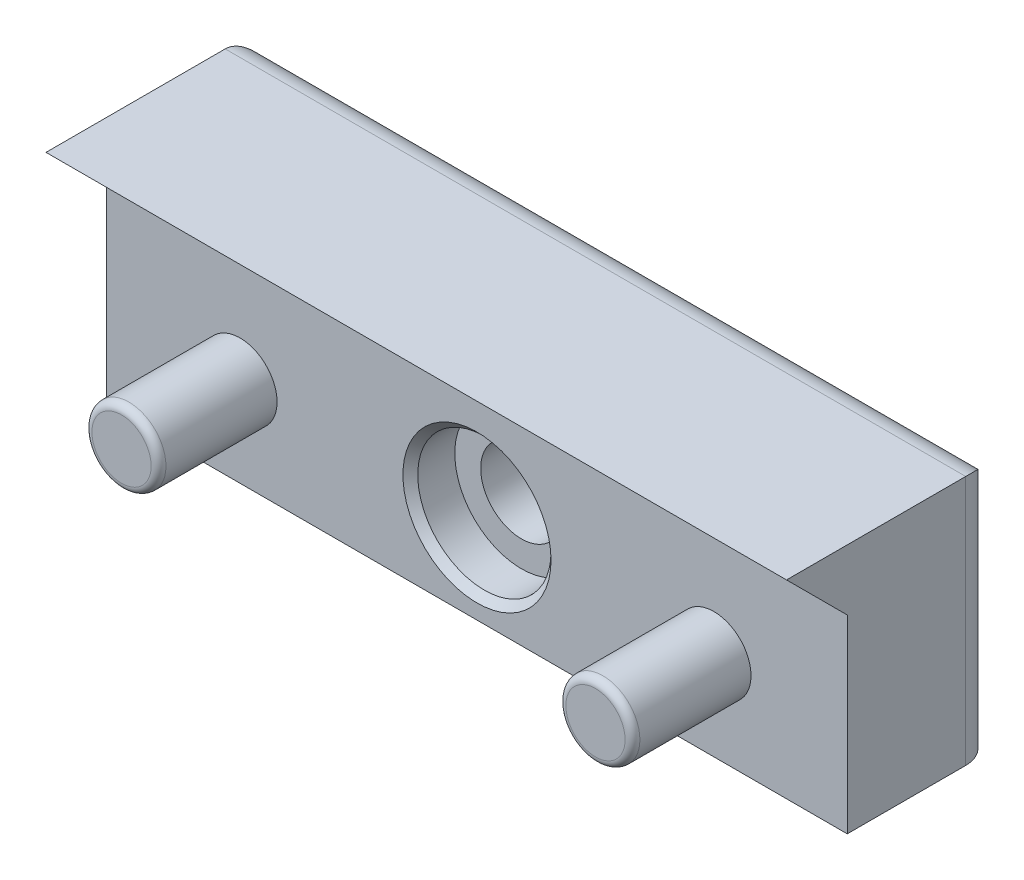
ISO-10303-21;
HEADER;
FILE_DESCRIPTION(('STEP AP214'),'2;1');
FILE_NAME('part.step','',(''),(''),'','','');
FILE_SCHEMA(('AUTOMOTIVE_DESIGN { 1 0 10303 214 1 1 1 1 }'));
ENDSEC;
DATA;
#1=APPLICATION_CONTEXT('core data for automotive mechanical design processes');
#2=APPLICATION_PROTOCOL_DEFINITION('international standard','automotive_design',2000,#1);
#3=PRODUCT_CONTEXT('',#1,'mechanical');
#4=PRODUCT('Part','Part','',(#3));
#5=PRODUCT_RELATED_PRODUCT_CATEGORY('part','',(#4));
#6=PRODUCT_DEFINITION_FORMATION('','',#4);
#7=PRODUCT_DEFINITION_CONTEXT('part definition',#1,'design');
#8=PRODUCT_DEFINITION('design','',#6,#7);
#9=PRODUCT_DEFINITION_SHAPE('','',#8);
#10=(LENGTH_UNIT() NAMED_UNIT(*) SI_UNIT(.MILLI.,.METRE.));
#11=(NAMED_UNIT(*) PLANE_ANGLE_UNIT() SI_UNIT($,.RADIAN.));
#12=(NAMED_UNIT(*) SI_UNIT($,.STERADIAN.) SOLID_ANGLE_UNIT());
#13=UNCERTAINTY_MEASURE_WITH_UNIT(LENGTH_MEASURE(1.E-05),#10,'distance_accuracy_value','');
#14=(GEOMETRIC_REPRESENTATION_CONTEXT(3) GLOBAL_UNCERTAINTY_ASSIGNED_CONTEXT((#13)) GLOBAL_UNIT_ASSIGNED_CONTEXT((#10,
#11,#12)) REPRESENTATION_CONTEXT('',''));
#15=CARTESIAN_POINT('',(0.,0.,0.));
#16=DIRECTION('',(0.,0.,1.));
#17=DIRECTION('',(1.,0.,0.));
#18=AXIS2_PLACEMENT_3D('',#15,#16,#17);
#19=CARTESIAN_POINT('',(0.,0.,0.));
#20=DIRECTION('',(0.,0.,1.));
#21=DIRECTION('',(1.,0.,0.));
#22=AXIS2_PLACEMENT_3D('',#19,#20,#21);
#23=CYLINDRICAL_SURFACE('',#22,2.75);
#24=CARTESIAN_POINT('',(0.,0.,0.));
#25=DIRECTION('',(0.,0.,1.));
#26=DIRECTION('',(1.,0.,0.));
#27=AXIS2_PLACEMENT_3D('',#24,#25,#26);
#28=CIRCLE('',#27,2.75);
#29=CARTESIAN_POINT('',(2.75,0.,0.));
#30=VERTEX_POINT('',#29);
#31=EDGE_CURVE('E140',#30,#30,#28,.T.);
#32=ORIENTED_EDGE('',*,*,#31,.F.);
#33=EDGE_LOOP('',(#32));
#34=FACE_BOUND('',#33,.T.);
#35=CARTESIAN_POINT('',(0.,0.,7.));
#36=DIRECTION('',(0.,0.,1.));
#37=DIRECTION('',(1.,0.,0.));
#38=AXIS2_PLACEMENT_3D('',#35,#36,#37);
#39=CIRCLE('',#38,2.75);
#40=CARTESIAN_POINT('',(2.75,0.,7.));
#41=VERTEX_POINT('',#40);
#42=EDGE_CURVE('E174',#41,#41,#39,.F.);
#43=ORIENTED_EDGE('',*,*,#42,.F.);
#44=EDGE_LOOP('',(#43));
#45=FACE_BOUND('',#44,.T.);
#46=ADVANCED_FACE('F33',(#34,#45),#23,.F.);
#47=CARTESIAN_POINT('',(-25.,-8.00000000000001,10.));
#48=DIRECTION('',(1.,0.,0.));
#49=DIRECTION('',(0.,0.,-1.));
#50=AXIS2_PLACEMENT_3D('',#47,#48,#49);
#51=PLANE('',#50);
#52=DIRECTION('',(0.,0.,1.));
#53=VECTOR('',#52,1.);
#54=CARTESIAN_POINT('',(-25.,10.9,10.));
#55=LINE('',#54,#53);
#56=CARTESIAN_POINT('',(-25.,10.9,2.));
#57=VERTEX_POINT('',#56);
#58=CARTESIAN_POINT('',(-25.,10.9,14.1));
#59=VERTEX_POINT('',#58);
#60=EDGE_CURVE('E95',#57,#59,#55,.T.);
#61=ORIENTED_EDGE('',*,*,#60,.F.);
#62=DIRECTION('',(0.,-1.,0.));
#63=VECTOR('',#62,1.);
#64=CARTESIAN_POINT('',(-25.,-8.00000000000001,2.));
#65=LINE('',#64,#63);
#66=CARTESIAN_POINT('',(-25.,-6.00000000000001,2.));
#67=VERTEX_POINT('',#66);
#68=EDGE_CURVE('E56',#57,#67,#65,.T.);
#69=ORIENTED_EDGE('',*,*,#68,.T.);
#70=DIRECTION('',(0.,0.,-1.));
#71=VECTOR('',#70,1.);
#72=CARTESIAN_POINT('',(-25.,-6.00000000000001,10.));
#73=LINE('',#72,#71);
#74=CARTESIAN_POINT('',(-25.,-6.00000000000001,10.));
#75=VERTEX_POINT('',#74);
#76=EDGE_CURVE('E130',#75,#67,#73,.T.);
#77=ORIENTED_EDGE('',*,*,#76,.F.);
#78=DIRECTION('',(0.,-1.,0.));
#79=VECTOR('',#78,1.);
#80=CARTESIAN_POINT('',(-25.,-8.00000000000001,10.));
#81=LINE('',#80,#79);
#82=CARTESIAN_POINT('',(-25.,6.8,10.));
#83=VERTEX_POINT('',#82);
#84=EDGE_CURVE('E117',#83,#75,#81,.T.);
#85=ORIENTED_EDGE('',*,*,#84,.F.);
#86=DIRECTION('',(0.,-0.707106781186548,-0.707106781186548));
#87=VECTOR('',#86,1.);
#88=CARTESIAN_POINT('',(-25.,10.9,14.1));
#89=LINE('',#88,#87);
#90=EDGE_CURVE('E109',#59,#83,#89,.T.);
#91=ORIENTED_EDGE('',*,*,#90,.F.);
#92=EDGE_LOOP('',(#61,#69,#77,#85,#91));
#93=FACE_BOUND('',#92,.T.);
#94=ADVANCED_FACE('F116',(#93),#51,.F.);
#95=CARTESIAN_POINT('',(25.,-8.,10.));
#96=DIRECTION('',(-1.,0.,0.));
#97=DIRECTION('',(0.,0.,1.));
#98=AXIS2_PLACEMENT_3D('',#95,#96,#97);
#99=PLANE('',#98);
#100=DIRECTION('',(0.,0.,1.));
#101=VECTOR('',#100,1.);
#102=CARTESIAN_POINT('',(25.,-6.,10.));
#103=LINE('',#102,#101);
#104=CARTESIAN_POINT('',(25.,-6.,2.));
#105=VERTEX_POINT('',#104);
#106=CARTESIAN_POINT('',(25.,-6.,10.));
#107=VERTEX_POINT('',#106);
#108=EDGE_CURVE('E104',#105,#107,#103,.T.);
#109=ORIENTED_EDGE('',*,*,#108,.F.);
#110=DIRECTION('',(0.,1.,0.));
#111=VECTOR('',#110,1.);
#112=CARTESIAN_POINT('',(25.,-8.,2.));
#113=LINE('',#112,#111);
#114=CARTESIAN_POINT('',(25.,10.9,2.));
#115=VERTEX_POINT('',#114);
#116=EDGE_CURVE('E170',#105,#115,#113,.T.);
#117=ORIENTED_EDGE('',*,*,#116,.T.);
#118=DIRECTION('',(0.,0.,-1.));
#119=VECTOR('',#118,1.);
#120=CARTESIAN_POINT('',(25.,10.9,10.));
#121=LINE('',#120,#119);
#122=CARTESIAN_POINT('',(25.,10.9,14.1));
#123=VERTEX_POINT('',#122);
#124=EDGE_CURVE('E105',#123,#115,#121,.T.);
#125=ORIENTED_EDGE('',*,*,#124,.F.);
#126=DIRECTION('',(0.,-0.707106781186548,-0.707106781186548));
#127=VECTOR('',#126,1.);
#128=CARTESIAN_POINT('',(25.,10.9,14.1));
#129=LINE('',#128,#127);
#130=CARTESIAN_POINT('',(25.,6.8,10.));
#131=VERTEX_POINT('',#130);
#132=EDGE_CURVE('E112',#123,#131,#129,.T.);
#133=ORIENTED_EDGE('',*,*,#132,.T.);
#134=DIRECTION('',(0.,1.,0.));
#135=VECTOR('',#134,1.);
#136=CARTESIAN_POINT('',(25.,-8.,10.));
#137=LINE('',#136,#135);
#138=EDGE_CURVE('E144',#107,#131,#137,.T.);
#139=ORIENTED_EDGE('',*,*,#138,.F.);
#140=EDGE_LOOP('',(#109,#117,#125,#133,#139));
#141=FACE_BOUND('',#140,.T.);
#142=ADVANCED_FACE('F200',(#141),#99,.F.);
#143=CARTESIAN_POINT('',(0.,0.,10.));
#144=DIRECTION('',(0.,0.,1.));
#145=DIRECTION('',(1.,0.,0.));
#146=AXIS2_PLACEMENT_3D('',#143,#144,#145);
#147=PLANE('',#146);
#148=CARTESIAN_POINT('',(0.,0.,10.));
#149=DIRECTION('',(0.,0.,1.));
#150=DIRECTION('',(1.,0.,0.));
#151=AXIS2_PLACEMENT_3D('',#148,#149,#150);
#152=CIRCLE('',#151,5.00000000000002);
#153=CARTESIAN_POINT('',(5.00000000000002,0.,10.));
#154=VERTEX_POINT('',#153);
#155=EDGE_CURVE('E11',#154,#154,#152,.F.);
#156=ORIENTED_EDGE('',*,*,#155,.T.);
#157=EDGE_LOOP('',(#156));
#158=FACE_BOUND('',#157,.T.);
#159=DIRECTION('',(1.,0.,0.));
#160=VECTOR('',#159,1.);
#161=CARTESIAN_POINT('',(-25.,6.8,10.));
#162=LINE('',#161,#160);
#163=EDGE_CURVE('E113',#83,#131,#162,.T.);
#164=ORIENTED_EDGE('',*,*,#163,.F.);
#165=ORIENTED_EDGE('',*,*,#84,.T.);
#166=DIRECTION('',(-1.,0.,0.));
#167=VECTOR('',#166,1.);
#168=CARTESIAN_POINT('',(25.,-6.,10.));
#169=LINE('',#168,#167);
#170=EDGE_CURVE('E127',#107,#75,#169,.T.);
#171=ORIENTED_EDGE('',*,*,#170,.F.);
#172=ORIENTED_EDGE('',*,*,#138,.T.);
#173=EDGE_LOOP('',(#164,#165,#171,#172));
#174=FACE_BOUND('',#173,.T.);
#175=CARTESIAN_POINT('',(16.,0.,10.));
#176=DIRECTION('',(0.,0.,1.));
#177=DIRECTION('',(1.,0.,0.));
#178=AXIS2_PLACEMENT_3D('',#175,#176,#177);
#179=CIRCLE('',#178,2.5);
#180=CARTESIAN_POINT('',(18.5,0.,10.));
#181=VERTEX_POINT('',#180);
#182=EDGE_CURVE('E134',#181,#181,#179,.T.);
#183=ORIENTED_EDGE('',*,*,#182,.F.);
#184=EDGE_LOOP('',(#183));
#185=FACE_BOUND('',#184,.T.);
#186=CARTESIAN_POINT('',(-16.,0.,10.));
#187=DIRECTION('',(0.,0.,1.));
#188=DIRECTION('',(1.,0.,0.));
#189=AXIS2_PLACEMENT_3D('',#186,#187,#188);
#190=CIRCLE('',#189,2.5);
#191=CARTESIAN_POINT('',(-13.5,0.,10.));
#192=VERTEX_POINT('',#191);
#193=EDGE_CURVE('E137',#192,#192,#190,.T.);
#194=ORIENTED_EDGE('',*,*,#193,.F.);
#195=EDGE_LOOP('',(#194));
#196=FACE_BOUND('',#195,.T.);
#197=ADVANCED_FACE('F208',(#158,#174,#185,#196),#147,.T.);
#198=CARTESIAN_POINT('',(0.,0.,0.));
#199=DIRECTION('',(0.,0.,1.));
#200=DIRECTION('',(1.,0.,0.));
#201=AXIS2_PLACEMENT_3D('',#198,#199,#200);
#202=PLANE('',#201);
#203=ORIENTED_EDGE('',*,*,#31,.T.);
#204=EDGE_LOOP('',(#203));
#205=FACE_BOUND('',#204,.T.);
#206=DIRECTION('',(1.,0.,0.));
#207=VECTOR('',#206,1.);
#208=CARTESIAN_POINT('',(25.,-6.,0.));
#209=LINE('',#208,#207);
#210=CARTESIAN_POINT('',(-23.,-6.00000000000001,0.));
#211=VERTEX_POINT('',#210);
#212=CARTESIAN_POINT('',(23.,-6.,0.));
#213=VERTEX_POINT('',#212);
#214=EDGE_CURVE('E132',#211,#213,#209,.T.);
#215=ORIENTED_EDGE('',*,*,#214,.F.);
#216=DIRECTION('',(0.,-1.,0.));
#217=VECTOR('',#216,1.);
#218=CARTESIAN_POINT('',(-23.,0.,0.));
#219=LINE('',#218,#217);
#220=CARTESIAN_POINT('',(-23.,8.9,0.));
#221=VERTEX_POINT('',#220);
#222=EDGE_CURVE('E164',#211,#221,#219,.F.);
#223=ORIENTED_EDGE('',*,*,#222,.T.);
#224=DIRECTION('',(-1.,0.,0.));
#225=VECTOR('',#224,1.);
#226=CARTESIAN_POINT('',(25.,8.9,0.));
#227=LINE('',#226,#225);
#228=CARTESIAN_POINT('',(23.,8.9,0.));
#229=VERTEX_POINT('',#228);
#230=EDGE_CURVE('E162',#221,#229,#227,.F.);
#231=ORIENTED_EDGE('',*,*,#230,.T.);
#232=DIRECTION('',(0.,1.,0.));
#233=VECTOR('',#232,1.);
#234=CARTESIAN_POINT('',(23.,0.,0.));
#235=LINE('',#234,#233);
#236=EDGE_CURVE('E160',#229,#213,#235,.F.);
#237=ORIENTED_EDGE('',*,*,#236,.T.);
#238=EDGE_LOOP('',(#215,#223,#231,#237));
#239=FACE_BOUND('',#238,.T.);
#240=ADVANCED_FACE('F211',(#205,#239),#202,.F.);
#241=CARTESIAN_POINT('',(-16.,0.,18.));
#242=DIRECTION('',(0.,0.,-1.));
#243=DIRECTION('',(-1.,0.,0.));
#244=AXIS2_PLACEMENT_3D('',#241,#242,#243);
#245=CYLINDRICAL_SURFACE('',#244,2.5);
#246=CARTESIAN_POINT('',(-16.,0.,17.5));
#247=DIRECTION('',(0.,0.,1.));
#248=DIRECTION('',(1.,0.,0.));
#249=AXIS2_PLACEMENT_3D('',#246,#247,#248);
#250=CIRCLE('',#249,2.5);
#251=CARTESIAN_POINT('',(-13.5,0.,17.5));
#252=VERTEX_POINT('',#251);
#253=EDGE_CURVE('E156',#252,#252,#250,.F.);
#254=ORIENTED_EDGE('',*,*,#253,.T.);
#255=EDGE_LOOP('',(#254));
#256=FACE_BOUND('',#255,.T.);
#257=ORIENTED_EDGE('',*,*,#193,.T.);
#258=EDGE_LOOP('',(#257));
#259=FACE_BOUND('',#258,.T.);
#260=ADVANCED_FACE('F206',(#256,#259),#245,.T.);
#261=CARTESIAN_POINT('',(-16.,0.,18.));
#262=DIRECTION('',(0.,0.,1.));
#263=DIRECTION('',(1.,0.,0.));
#264=AXIS2_PLACEMENT_3D('',#261,#262,#263);
#265=PLANE('',#264);
#266=CARTESIAN_POINT('',(-16.,0.,18.));
#267=DIRECTION('',(0.,0.,1.));
#268=DIRECTION('',(1.,0.,0.));
#269=AXIS2_PLACEMENT_3D('',#266,#267,#268);
#270=CIRCLE('',#269,2.);
#271=CARTESIAN_POINT('',(-14.,0.,18.));
#272=VERTEX_POINT('',#271);
#273=EDGE_CURVE('E153',#272,#272,#270,.T.);
#274=ORIENTED_EDGE('',*,*,#273,.T.);
#275=EDGE_LOOP('',(#274));
#276=FACE_BOUND('',#275,.T.);
#277=ADVANCED_FACE('F255',(#276),#265,.T.);
#278=CARTESIAN_POINT('',(16.,0.,18.));
#279=DIRECTION('',(0.,0.,-1.));
#280=DIRECTION('',(-1.,0.,0.));
#281=AXIS2_PLACEMENT_3D('',#278,#279,#280);
#282=CYLINDRICAL_SURFACE('',#281,2.5);
#283=CARTESIAN_POINT('',(16.,0.,17.5));
#284=DIRECTION('',(0.,0.,1.));
#285=DIRECTION('',(1.,0.,0.));
#286=AXIS2_PLACEMENT_3D('',#283,#284,#285);
#287=CIRCLE('',#286,2.5);
#288=CARTESIAN_POINT('',(18.5,0.,17.5));
#289=VERTEX_POINT('',#288);
#290=EDGE_CURVE('E150',#289,#289,#287,.F.);
#291=ORIENTED_EDGE('',*,*,#290,.T.);
#292=EDGE_LOOP('',(#291));
#293=FACE_BOUND('',#292,.T.);
#294=ORIENTED_EDGE('',*,*,#182,.T.);
#295=EDGE_LOOP('',(#294));
#296=FACE_BOUND('',#295,.T.);
#297=ADVANCED_FACE('F260',(#293,#296),#282,.T.);
#298=CARTESIAN_POINT('',(16.,0.,18.));
#299=DIRECTION('',(0.,0.,1.));
#300=DIRECTION('',(1.,0.,0.));
#301=AXIS2_PLACEMENT_3D('',#298,#299,#300);
#302=PLANE('',#301);
#303=CARTESIAN_POINT('',(16.,0.,18.));
#304=DIRECTION('',(0.,0.,1.));
#305=DIRECTION('',(1.,0.,0.));
#306=AXIS2_PLACEMENT_3D('',#303,#304,#305);
#307=CIRCLE('',#306,2.);
#308=CARTESIAN_POINT('',(18.,0.,18.));
#309=VERTEX_POINT('',#308);
#310=EDGE_CURVE('E147',#309,#309,#307,.T.);
#311=ORIENTED_EDGE('',*,*,#310,.T.);
#312=EDGE_LOOP('',(#311));
#313=FACE_BOUND('',#312,.T.);
#314=ADVANCED_FACE('F223',(#313),#302,.T.);
#315=CARTESIAN_POINT('',(16.,0.,17.5));
#316=DIRECTION('',(0.,0.,1.));
#317=DIRECTION('',(1.,0.,0.));
#318=AXIS2_PLACEMENT_3D('',#315,#316,#317);
#319=TOROIDAL_SURFACE('',#318,2.,0.5);
#320=ORIENTED_EDGE('',*,*,#290,.F.);
#321=EDGE_LOOP('',(#320));
#322=FACE_BOUND('',#321,.T.);
#323=ORIENTED_EDGE('',*,*,#310,.F.);
#324=EDGE_LOOP('',(#323));
#325=FACE_BOUND('',#324,.T.);
#326=ADVANCED_FACE('F219',(#322,#325),#319,.T.);
#327=CARTESIAN_POINT('',(-16.,0.,17.5));
#328=DIRECTION('',(0.,0.,1.));
#329=DIRECTION('',(1.,0.,0.));
#330=AXIS2_PLACEMENT_3D('',#327,#328,#329);
#331=TOROIDAL_SURFACE('',#330,2.,0.5);
#332=ORIENTED_EDGE('',*,*,#253,.F.);
#333=EDGE_LOOP('',(#332));
#334=FACE_BOUND('',#333,.T.);
#335=ORIENTED_EDGE('',*,*,#273,.F.);
#336=EDGE_LOOP('',(#335));
#337=FACE_BOUND('',#336,.T.);
#338=ADVANCED_FACE('F222',(#334,#337),#331,.T.);
#339=CARTESIAN_POINT('',(0.,-6.,0.));
#340=DIRECTION('',(0.,1.,0.));
#341=DIRECTION('',(-1.,0.,0.));
#342=AXIS2_PLACEMENT_3D('',#339,#340,#341);
#343=PLANE('',#342);
#344=ORIENTED_EDGE('',*,*,#76,.T.);
#345=CARTESIAN_POINT('',(-23.,-6.00000000000001,2.));
#346=DIRECTION('',(0.,1.,0.));
#347=DIRECTION('',(-1.,0.,0.));
#348=AXIS2_PLACEMENT_3D('',#345,#346,#347);
#349=CIRCLE('',#348,2.);
#350=EDGE_CURVE('E168',#67,#211,#349,.F.);
#351=ORIENTED_EDGE('',*,*,#350,.T.);
#352=ORIENTED_EDGE('',*,*,#214,.T.);
#353=CARTESIAN_POINT('',(23.,-6.,2.));
#354=DIRECTION('',(0.,1.,0.));
#355=DIRECTION('',(-1.,0.,0.));
#356=AXIS2_PLACEMENT_3D('',#353,#354,#355);
#357=CIRCLE('',#356,2.);
#358=EDGE_CURVE('E48',#213,#105,#357,.F.);
#359=ORIENTED_EDGE('',*,*,#358,.T.);
#360=ORIENTED_EDGE('',*,*,#108,.T.);
#361=ORIENTED_EDGE('',*,*,#170,.T.);
#362=EDGE_LOOP('',(#344,#351,#352,#359,#360,#361));
#363=FACE_BOUND('',#362,.T.);
#364=ADVANCED_FACE('F227',(#363),#343,.F.);
#365=CARTESIAN_POINT('',(0.,10.9,0.));
#366=DIRECTION('',(0.,1.,0.));
#367=DIRECTION('',(-1.,0.,0.));
#368=AXIS2_PLACEMENT_3D('',#365,#366,#367);
#369=PLANE('',#368);
#370=ORIENTED_EDGE('',*,*,#124,.T.);
#371=DIRECTION('',(-1.,0.,0.));
#372=VECTOR('',#371,1.);
#373=CARTESIAN_POINT('',(-25.,10.9,2.));
#374=LINE('',#373,#372);
#375=EDGE_CURVE('E102',#115,#57,#374,.T.);
#376=ORIENTED_EDGE('',*,*,#375,.T.);
#377=ORIENTED_EDGE('',*,*,#60,.T.);
#378=DIRECTION('',(1.,0.,0.));
#379=VECTOR('',#378,1.);
#380=CARTESIAN_POINT('',(-25.,10.9,14.1));
#381=LINE('',#380,#379);
#382=EDGE_CURVE('E99',#59,#123,#381,.T.);
#383=ORIENTED_EDGE('',*,*,#382,.T.);
#384=EDGE_LOOP('',(#370,#376,#377,#383));
#385=FACE_BOUND('',#384,.T.);
#386=ADVANCED_FACE('F98',(#385),#369,.T.);
#387=CARTESIAN_POINT('',(-25.,10.9,14.1));
#388=DIRECTION('',(0.,-0.707106781186548,0.707106781186548));
#389=DIRECTION('',(0.,-0.707106781186548,-0.707106781186548));
#390=AXIS2_PLACEMENT_3D('',#387,#388,#389);
#391=PLANE('',#390);
#392=ORIENTED_EDGE('',*,*,#132,.F.);
#393=ORIENTED_EDGE('',*,*,#382,.F.);
#394=ORIENTED_EDGE('',*,*,#90,.T.);
#395=ORIENTED_EDGE('',*,*,#163,.T.);
#396=EDGE_LOOP('',(#392,#393,#394,#395));
#397=FACE_BOUND('',#396,.T.);
#398=ADVANCED_FACE('F108',(#397),#391,.T.);
#399=CARTESIAN_POINT('',(23.,-8.,2.));
#400=DIRECTION('',(0.,1.,0.));
#401=DIRECTION('',(0.,0.,1.));
#402=AXIS2_PLACEMENT_3D('',#399,#400,#401);
#403=CYLINDRICAL_SURFACE('',#402,2.);
#404=ORIENTED_EDGE('',*,*,#358,.F.);
#405=ORIENTED_EDGE('',*,*,#236,.F.);
#406=CARTESIAN_POINT('',(23.,8.9,2.));
#407=DIRECTION('',(-0.707106781186548,0.707106781186547,0.));
#408=DIRECTION('',(0.707106781186547,0.707106781186548,0.));
#409=AXIS2_PLACEMENT_3D('',#406,#407,#408);
#410=ELLIPSE('',#409,2.82842712474619,2.);
#411=EDGE_CURVE('E119',#115,#229,#410,.T.);
#412=ORIENTED_EDGE('',*,*,#411,.F.);
#413=ORIENTED_EDGE('',*,*,#116,.F.);
#414=EDGE_LOOP('',(#404,#405,#412,#413));
#415=FACE_BOUND('',#414,.T.);
#416=ADVANCED_FACE('F235',(#415),#403,.T.);
#417=CARTESIAN_POINT('',(-23.,-8.00000000000001,2.));
#418=DIRECTION('',(0.,-1.,0.));
#419=DIRECTION('',(0.,0.,-1.));
#420=AXIS2_PLACEMENT_3D('',#417,#418,#419);
#421=CYLINDRICAL_SURFACE('',#420,2.);
#422=ORIENTED_EDGE('',*,*,#350,.F.);
#423=ORIENTED_EDGE('',*,*,#68,.F.);
#424=CARTESIAN_POINT('',(-23.,8.9,2.));
#425=DIRECTION('',(-0.707106781186547,-0.707106781186548,0.));
#426=DIRECTION('',(0.707106781186548,-0.707106781186547,0.));
#427=AXIS2_PLACEMENT_3D('',#424,#425,#426);
#428=ELLIPSE('',#427,2.82842712474619,2.);
#429=EDGE_CURVE('E172',#221,#57,#428,.F.);
#430=ORIENTED_EDGE('',*,*,#429,.F.);
#431=ORIENTED_EDGE('',*,*,#222,.F.);
#432=EDGE_LOOP('',(#422,#423,#430,#431));
#433=FACE_BOUND('',#432,.T.);
#434=ADVANCED_FACE('F232',(#433),#421,.T.);
#435=CARTESIAN_POINT('',(0.,8.9,2.));
#436=DIRECTION('',(1.,0.,0.));
#437=DIRECTION('',(0.,1.,0.));
#438=AXIS2_PLACEMENT_3D('',#435,#436,#437);
#439=CYLINDRICAL_SURFACE('',#438,2.);
#440=ORIENTED_EDGE('',*,*,#411,.T.);
#441=ORIENTED_EDGE('',*,*,#230,.F.);
#442=ORIENTED_EDGE('',*,*,#429,.T.);
#443=ORIENTED_EDGE('',*,*,#375,.F.);
#444=EDGE_LOOP('',(#440,#441,#442,#443));
#445=FACE_BOUND('',#444,.T.);
#446=ADVANCED_FACE('F229',(#445),#439,.T.);
#447=CARTESIAN_POINT('',(0.,0.,7.));
#448=DIRECTION('',(0.,0.,1.));
#449=DIRECTION('',(1.,0.,0.));
#450=AXIS2_PLACEMENT_3D('',#447,#448,#449);
#451=PLANE('',#450);
#452=CARTESIAN_POINT('',(0.,0.,7.));
#453=DIRECTION('',(0.,0.,1.));
#454=DIRECTION('',(1.,0.,0.));
#455=AXIS2_PLACEMENT_3D('',#452,#453,#454);
#456=CIRCLE('',#455,4.5);
#457=CARTESIAN_POINT('',(4.5,0.,7.));
#458=VERTEX_POINT('',#457);
#459=EDGE_CURVE('E122',#458,#458,#456,.T.);
#460=ORIENTED_EDGE('',*,*,#459,.T.);
#461=EDGE_LOOP('',(#460));
#462=FACE_BOUND('',#461,.T.);
#463=ORIENTED_EDGE('',*,*,#42,.T.);
#464=EDGE_LOOP('',(#463));
#465=FACE_BOUND('',#464,.T.);
#466=ADVANCED_FACE('F189',(#462,#465),#451,.T.);
#467=CARTESIAN_POINT('',(0.,0.,7.));
#468=DIRECTION('',(0.,0.,1.));
#469=DIRECTION('',(1.,0.,0.));
#470=AXIS2_PLACEMENT_3D('',#467,#468,#469);
#471=CYLINDRICAL_SURFACE('',#470,4.5);
#472=CARTESIAN_POINT('',(0.,0.,9.49999999999998));
#473=DIRECTION('',(0.,0.,1.));
#474=DIRECTION('',(1.,0.,0.));
#475=AXIS2_PLACEMENT_3D('',#472,#473,#474);
#476=CIRCLE('',#475,4.5);
#477=CARTESIAN_POINT('',(4.5,0.,9.49999999999998));
#478=VERTEX_POINT('',#477);
#479=EDGE_CURVE('E41',#478,#478,#476,.T.);
#480=ORIENTED_EDGE('',*,*,#479,.T.);
#481=EDGE_LOOP('',(#480));
#482=FACE_BOUND('',#481,.T.);
#483=ORIENTED_EDGE('',*,*,#459,.F.);
#484=EDGE_LOOP('',(#483));
#485=FACE_BOUND('',#484,.T.);
#486=ADVANCED_FACE('F181',(#482,#485),#471,.F.);
#487=CARTESIAN_POINT('',(0.,0.,9.49999999999998));
#488=DIRECTION('',(0.,0.,1.));
#489=DIRECTION('',(1.,0.,0.));
#490=AXIS2_PLACEMENT_3D('',#487,#488,#489);
#491=CONICAL_SURFACE('',#490,4.5,0.785398163397446);
#492=ORIENTED_EDGE('',*,*,#155,.F.);
#493=EDGE_LOOP('',(#492));
#494=FACE_BOUND('',#493,.T.);
#495=ORIENTED_EDGE('',*,*,#479,.F.);
#496=EDGE_LOOP('',(#495));
#497=FACE_BOUND('',#496,.T.);
#498=ADVANCED_FACE('F35',(#494,#497),#491,.F.);
#499=CLOSED_SHELL('',(#46,#94,#142,#197,#240,#260,#277,#297,#314,#326,#338,#364,#386,#398,#416,
#434,#446,#466,#486,#498));
#500=MANIFOLD_SOLID_BREP('B2',#499);
#501=ADVANCED_BREP_SHAPE_REPRESENTATION('',(#18,#500),#14);
#502=SHAPE_DEFINITION_REPRESENTATION(#9,#501);
ENDSEC;
END-ISO-10303-21;
